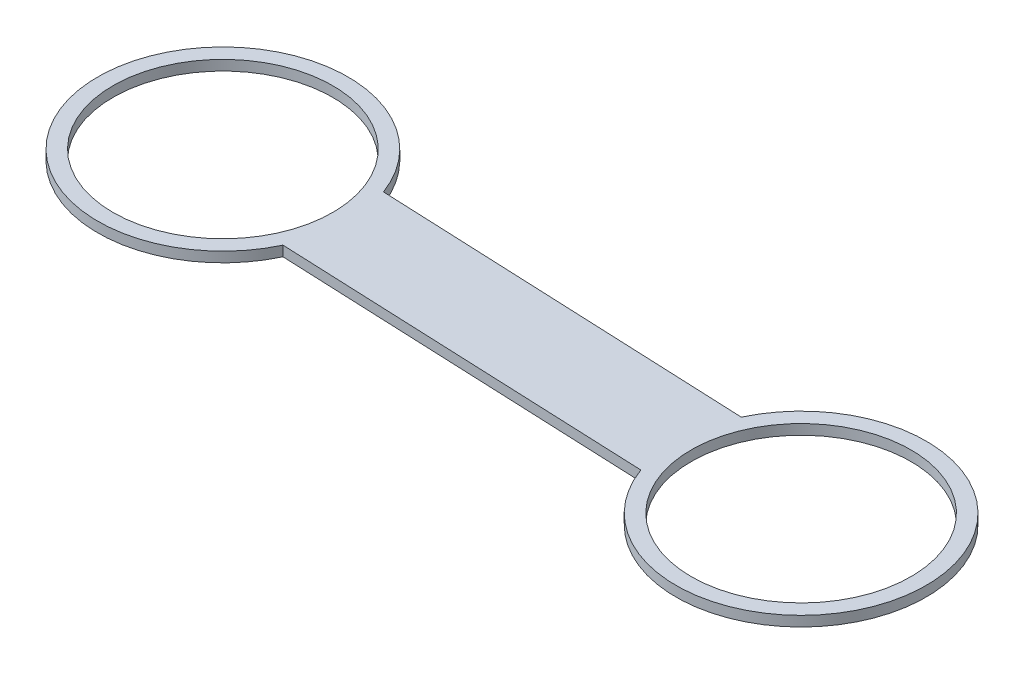
ISO-10303-21;
HEADER;
FILE_DESCRIPTION(('STEP AP214'),'2;1');
FILE_NAME('part.step','',(''),(''),'','','');
FILE_SCHEMA(('AUTOMOTIVE_DESIGN { 1 0 10303 214 1 1 1 1 }'));
ENDSEC;
DATA;
#1=APPLICATION_CONTEXT('core data for automotive mechanical design processes');
#2=APPLICATION_PROTOCOL_DEFINITION('international standard','automotive_design',2000,#1);
#3=PRODUCT_CONTEXT('',#1,'mechanical');
#4=PRODUCT('Part','Part','',(#3));
#5=PRODUCT_RELATED_PRODUCT_CATEGORY('part','',(#4));
#6=PRODUCT_DEFINITION_FORMATION('','',#4);
#7=PRODUCT_DEFINITION_CONTEXT('part definition',#1,'design');
#8=PRODUCT_DEFINITION('design','',#6,#7);
#9=PRODUCT_DEFINITION_SHAPE('','',#8);
#10=(LENGTH_UNIT() NAMED_UNIT(*) SI_UNIT(.MILLI.,.METRE.));
#11=(NAMED_UNIT(*) PLANE_ANGLE_UNIT() SI_UNIT($,.RADIAN.));
#12=(NAMED_UNIT(*) SI_UNIT($,.STERADIAN.) SOLID_ANGLE_UNIT());
#13=UNCERTAINTY_MEASURE_WITH_UNIT(LENGTH_MEASURE(1.E-05),#10,'distance_accuracy_value','');
#14=(GEOMETRIC_REPRESENTATION_CONTEXT(3) GLOBAL_UNCERTAINTY_ASSIGNED_CONTEXT((#13)) GLOBAL_UNIT_ASSIGNED_CONTEXT((#10,
#11,#12)) REPRESENTATION_CONTEXT('',''));
#15=CARTESIAN_POINT('',(0.,0.,0.));
#16=DIRECTION('',(0.,0.,1.));
#17=DIRECTION('',(1.,0.,0.));
#18=AXIS2_PLACEMENT_3D('',#15,#16,#17);
#19=CARTESIAN_POINT('',(178.811009985878,3.,7.77208167310776));
#20=DIRECTION('',(0.,1.,0.));
#21=DIRECTION('',(0.,0.,1.));
#22=AXIS2_PLACEMENT_3D('',#19,#20,#21);
#23=PLANE('',#22);
#24=CARTESIAN_POINT('',(0.,3.,0.));
#25=DIRECTION('',(0.,1.,0.));
#26=DIRECTION('',(0.,0.,1.));
#27=AXIS2_PLACEMENT_3D('',#24,#25,#26);
#28=CIRCLE('',#27,32.5);
#29=CARTESIAN_POINT('',(0.,3.,32.5));
#30=VERTEX_POINT('',#29);
#31=EDGE_CURVE('E100',#30,#30,#28,.T.);
#32=ORIENTED_EDGE('',*,*,#31,.F.);
#33=EDGE_LOOP('',(#32));
#34=FACE_BOUND('',#33,.T.);
#35=CARTESIAN_POINT('',(178.811009985878,3.,7.77208167310776));
#36=DIRECTION('',(0.,1.,0.));
#37=DIRECTION('',(0.,0.,1.));
#38=AXIS2_PLACEMENT_3D('',#35,#36,#37);
#39=CIRCLE('',#38,37.);
#40=CARTESIAN_POINT('',(144.033066177761,3.,20.4011997927322));
#41=VERTEX_POINT('',#40);
#42=CARTESIAN_POINT('',(145.341023246645,3.,-8.00004524990167));
#43=VERTEX_POINT('',#42);
#44=EDGE_CURVE('E85',#41,#43,#39,.T.);
#45=ORIENTED_EDGE('',*,*,#44,.T.);
#46=DIRECTION('',(-0.999069440720653,0.,-0.0431306459274788));
#47=VECTOR('',#46,1.);
#48=CARTESIAN_POINT('',(34.7244553413585,3.,-12.7754530740009));
#49=LINE('',#48,#47);
#50=CARTESIAN_POINT('',(34.7244553413585,3.,-12.7754530740009));
#51=VERTEX_POINT('',#50);
#52=EDGE_CURVE('E80',#43,#51,#49,.T.);
#53=ORIENTED_EDGE('',*,*,#52,.T.);
#54=CARTESIAN_POINT('',(0.,3.,0.));
#55=DIRECTION('',(0.,1.,0.));
#56=DIRECTION('',(0.,0.,1.));
#57=AXIS2_PLACEMENT_3D('',#54,#55,#56);
#58=CIRCLE('',#57,37.);
#59=CARTESIAN_POINT('',(33.4954140569429,3.,15.7180544964684));
#60=VERTEX_POINT('',#59);
#61=EDGE_CURVE('E83',#51,#60,#58,.T.);
#62=ORIENTED_EDGE('',*,*,#61,.T.);
#63=DIRECTION('',(0.99910372636415,0.,0.042328996743008));
#64=VECTOR('',#63,1.);
#65=CARTESIAN_POINT('',(33.4954140569429,3.,15.7180544964684));
#66=LINE('',#65,#64);
#67=EDGE_CURVE('E50',#60,#41,#66,.T.);
#68=ORIENTED_EDGE('',*,*,#67,.T.);
#69=EDGE_LOOP('',(#45,#53,#62,#68));
#70=FACE_BOUND('',#69,.T.);
#71=CARTESIAN_POINT('',(178.811009985878,3.,7.77208167310776));
#72=DIRECTION('',(0.,1.,0.));
#73=DIRECTION('',(0.,0.,1.));
#74=AXIS2_PLACEMENT_3D('',#71,#72,#73);
#75=CIRCLE('',#74,32.5);
#76=CARTESIAN_POINT('',(178.811009985878,3.,40.2720816731078));
#77=VERTEX_POINT('',#76);
#78=EDGE_CURVE('E115',#77,#77,#75,.T.);
#79=ORIENTED_EDGE('',*,*,#78,.F.);
#80=EDGE_LOOP('',(#79));
#81=FACE_BOUND('',#80,.T.);
#82=ADVANCED_FACE('F33',(#34,#70,#81),#23,.T.);
#83=CARTESIAN_POINT('',(178.811009985878,0.,7.77208167310776));
#84=DIRECTION('',(0.,1.,0.));
#85=DIRECTION('',(0.,0.,1.));
#86=AXIS2_PLACEMENT_3D('',#83,#84,#85);
#87=PLANE('',#86);
#88=CARTESIAN_POINT('',(178.811009985878,0.,7.77208167310776));
#89=DIRECTION('',(0.,1.,0.));
#90=DIRECTION('',(0.,0.,1.));
#91=AXIS2_PLACEMENT_3D('',#88,#89,#90);
#92=CIRCLE('',#91,37.);
#93=CARTESIAN_POINT('',(144.033066177761,0.,20.4011997927322));
#94=VERTEX_POINT('',#93);
#95=CARTESIAN_POINT('',(145.341023246645,0.,-8.00004524990167));
#96=VERTEX_POINT('',#95);
#97=EDGE_CURVE('E97',#94,#96,#92,.T.);
#98=ORIENTED_EDGE('',*,*,#97,.F.);
#99=DIRECTION('',(0.99910372636415,0.,0.042328996743008));
#100=VECTOR('',#99,1.);
#101=CARTESIAN_POINT('',(33.4954140569429,0.,15.7180544964684));
#102=LINE('',#101,#100);
#103=CARTESIAN_POINT('',(33.4954140569429,0.,15.7180544964684));
#104=VERTEX_POINT('',#103);
#105=EDGE_CURVE('E73',#104,#94,#102,.T.);
#106=ORIENTED_EDGE('',*,*,#105,.F.);
#107=CARTESIAN_POINT('',(0.,0.,0.));
#108=DIRECTION('',(0.,1.,0.));
#109=DIRECTION('',(0.,0.,1.));
#110=AXIS2_PLACEMENT_3D('',#107,#108,#109);
#111=CIRCLE('',#110,37.);
#112=CARTESIAN_POINT('',(34.7244553413585,0.,-12.7754530740009));
#113=VERTEX_POINT('',#112);
#114=EDGE_CURVE('E67',#113,#104,#111,.T.);
#115=ORIENTED_EDGE('',*,*,#114,.F.);
#116=DIRECTION('',(-0.999069440720653,0.,-0.0431306459274788));
#117=VECTOR('',#116,1.);
#118=CARTESIAN_POINT('',(34.7244553413585,0.,-12.7754530740009));
#119=LINE('',#118,#117);
#120=EDGE_CURVE('E89',#96,#113,#119,.T.);
#121=ORIENTED_EDGE('',*,*,#120,.F.);
#122=EDGE_LOOP('',(#98,#106,#115,#121));
#123=FACE_BOUND('',#122,.T.);
#124=CARTESIAN_POINT('',(0.,0.,0.));
#125=DIRECTION('',(0.,1.,0.));
#126=DIRECTION('',(0.,0.,1.));
#127=AXIS2_PLACEMENT_3D('',#124,#125,#126);
#128=CIRCLE('',#127,32.5);
#129=CARTESIAN_POINT('',(0.,0.,32.5));
#130=VERTEX_POINT('',#129);
#131=EDGE_CURVE('E112',#130,#130,#128,.T.);
#132=ORIENTED_EDGE('',*,*,#131,.T.);
#133=EDGE_LOOP('',(#132));
#134=FACE_BOUND('',#133,.T.);
#135=CARTESIAN_POINT('',(178.811009985878,0.,7.77208167310776));
#136=DIRECTION('',(0.,1.,0.));
#137=DIRECTION('',(0.,0.,1.));
#138=AXIS2_PLACEMENT_3D('',#135,#136,#137);
#139=CIRCLE('',#138,32.5);
#140=CARTESIAN_POINT('',(178.811009985878,0.,40.2720816731078));
#141=VERTEX_POINT('',#140);
#142=EDGE_CURVE('E118',#141,#141,#139,.T.);
#143=ORIENTED_EDGE('',*,*,#142,.T.);
#144=EDGE_LOOP('',(#143));
#145=FACE_BOUND('',#144,.T.);
#146=ADVANCED_FACE('F108',(#123,#134,#145),#87,.F.);
#147=CARTESIAN_POINT('',(178.811009985878,3.,7.77208167310776));
#148=DIRECTION('',(0.,-1.,0.));
#149=DIRECTION('',(0.,0.,-1.));
#150=AXIS2_PLACEMENT_3D('',#147,#148,#149);
#151=CYLINDRICAL_SURFACE('',#150,37.);
#152=ORIENTED_EDGE('',*,*,#97,.T.);
#153=DIRECTION('',(0.,-1.,0.));
#154=VECTOR('',#153,1.);
#155=CARTESIAN_POINT('',(145.341023246645,3.,-8.00004524990167));
#156=LINE('',#155,#154);
#157=EDGE_CURVE('E11',#43,#96,#156,.T.);
#158=ORIENTED_EDGE('',*,*,#157,.F.);
#159=ORIENTED_EDGE('',*,*,#44,.F.);
#160=DIRECTION('',(0.,-1.,0.));
#161=VECTOR('',#160,1.);
#162=CARTESIAN_POINT('',(144.033066177761,3.,20.4011997927322));
#163=LINE('',#162,#161);
#164=EDGE_CURVE('E93',#41,#94,#163,.T.);
#165=ORIENTED_EDGE('',*,*,#164,.T.);
#166=EDGE_LOOP('',(#152,#158,#159,#165));
#167=FACE_BOUND('',#166,.T.);
#168=ADVANCED_FACE('F35',(#167),#151,.T.);
#169=CARTESIAN_POINT('',(34.7244553413585,3.,-12.7754530740009));
#170=DIRECTION('',(-0.0431306459274788,0.,0.999069440720653));
#171=DIRECTION('',(0.999069440720653,0.,0.0431306459274788));
#172=AXIS2_PLACEMENT_3D('',#169,#170,#171);
#173=PLANE('',#172);
#174=ORIENTED_EDGE('',*,*,#120,.T.);
#175=DIRECTION('',(0.,-1.,0.));
#176=VECTOR('',#175,1.);
#177=CARTESIAN_POINT('',(34.7244553413585,3.,-12.7754530740009));
#178=LINE('',#177,#176);
#179=EDGE_CURVE('E42',#51,#113,#178,.T.);
#180=ORIENTED_EDGE('',*,*,#179,.F.);
#181=ORIENTED_EDGE('',*,*,#52,.F.);
#182=ORIENTED_EDGE('',*,*,#157,.T.);
#183=EDGE_LOOP('',(#174,#180,#181,#182));
#184=FACE_BOUND('',#183,.T.);
#185=ADVANCED_FACE('F88',(#184),#173,.F.);
#186=CARTESIAN_POINT('',(0.,3.,0.));
#187=DIRECTION('',(0.,-1.,0.));
#188=DIRECTION('',(0.,0.,-1.));
#189=AXIS2_PLACEMENT_3D('',#186,#187,#188);
#190=CYLINDRICAL_SURFACE('',#189,37.);
#191=ORIENTED_EDGE('',*,*,#114,.T.);
#192=DIRECTION('',(0.,-1.,0.));
#193=VECTOR('',#192,1.);
#194=CARTESIAN_POINT('',(33.4954140569429,3.,15.7180544964684));
#195=LINE('',#194,#193);
#196=EDGE_CURVE('E90',#60,#104,#195,.T.);
#197=ORIENTED_EDGE('',*,*,#196,.F.);
#198=ORIENTED_EDGE('',*,*,#61,.F.);
#199=ORIENTED_EDGE('',*,*,#179,.T.);
#200=EDGE_LOOP('',(#191,#197,#198,#199));
#201=FACE_BOUND('',#200,.T.);
#202=ADVANCED_FACE('F91',(#201),#190,.T.);
#203=CARTESIAN_POINT('',(33.4954140569429,3.,15.7180544964684));
#204=DIRECTION('',(0.042328996743008,0.,-0.99910372636415));
#205=DIRECTION('',(-0.99910372636415,0.,-0.042328996743008));
#206=AXIS2_PLACEMENT_3D('',#203,#204,#205);
#207=PLANE('',#206);
#208=ORIENTED_EDGE('',*,*,#105,.T.);
#209=ORIENTED_EDGE('',*,*,#164,.F.);
#210=ORIENTED_EDGE('',*,*,#67,.F.);
#211=ORIENTED_EDGE('',*,*,#196,.T.);
#212=EDGE_LOOP('',(#208,#209,#210,#211));
#213=FACE_BOUND('',#212,.T.);
#214=ADVANCED_FACE('F105',(#213),#207,.F.);
#215=CARTESIAN_POINT('',(0.,3.,0.));
#216=DIRECTION('',(0.,-1.,0.));
#217=DIRECTION('',(0.,0.,-1.));
#218=AXIS2_PLACEMENT_3D('',#215,#216,#217);
#219=CYLINDRICAL_SURFACE('',#218,32.5);
#220=ORIENTED_EDGE('',*,*,#31,.T.);
#221=EDGE_LOOP('',(#220));
#222=FACE_BOUND('',#221,.T.);
#223=ORIENTED_EDGE('',*,*,#131,.F.);
#224=EDGE_LOOP('',(#223));
#225=FACE_BOUND('',#224,.T.);
#226=ADVANCED_FACE('F135',(#222,#225),#219,.F.);
#227=CARTESIAN_POINT('',(178.811009985878,3.,7.77208167310776));
#228=DIRECTION('',(0.,-1.,0.));
#229=DIRECTION('',(0.,0.,-1.));
#230=AXIS2_PLACEMENT_3D('',#227,#228,#229);
#231=CYLINDRICAL_SURFACE('',#230,32.5);
#232=ORIENTED_EDGE('',*,*,#78,.T.);
#233=EDGE_LOOP('',(#232));
#234=FACE_BOUND('',#233,.T.);
#235=ORIENTED_EDGE('',*,*,#142,.F.);
#236=EDGE_LOOP('',(#235));
#237=FACE_BOUND('',#236,.T.);
#238=ADVANCED_FACE('F124',(#234,#237),#231,.F.);
#239=CLOSED_SHELL('',(#82,#146,#168,#185,#202,#214,#226,#238));
#240=MANIFOLD_SOLID_BREP('B2',#239);
#241=ADVANCED_BREP_SHAPE_REPRESENTATION('',(#18,#240),#14);
#242=SHAPE_DEFINITION_REPRESENTATION(#9,#241);
ENDSEC;
END-ISO-10303-21;
